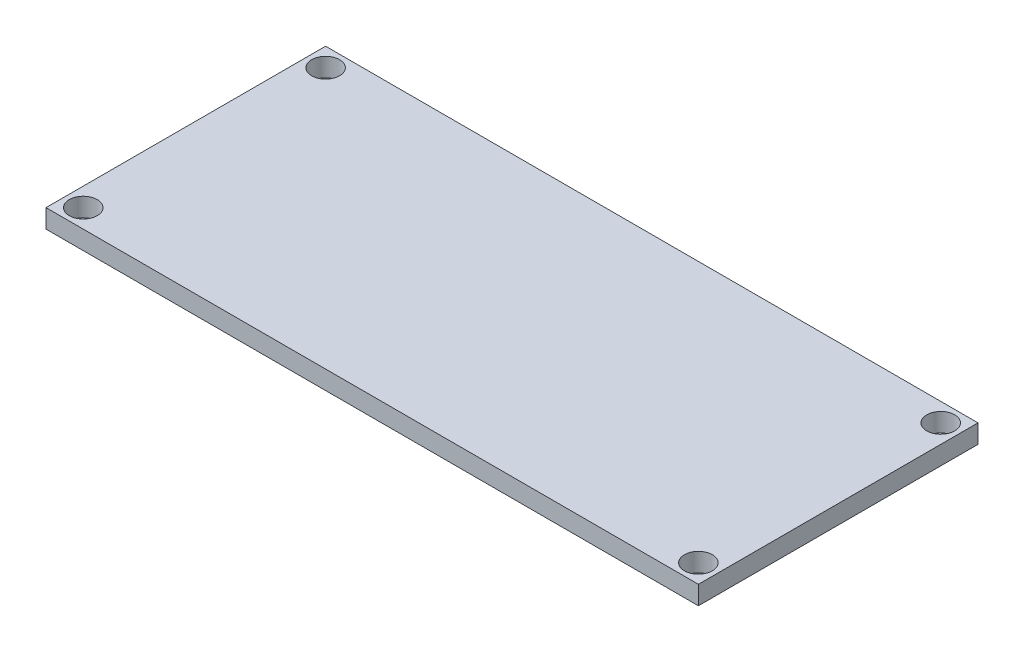
ISO-10303-21;
HEADER;
FILE_DESCRIPTION(('STEP AP214'),'2;1');
FILE_NAME('part.step','',(''),(''),'','','');
FILE_SCHEMA(('AUTOMOTIVE_DESIGN { 1 0 10303 214 1 1 1 1 }'));
ENDSEC;
DATA;
#1=APPLICATION_CONTEXT('core data for automotive mechanical design processes');
#2=APPLICATION_PROTOCOL_DEFINITION('international standard','automotive_design',2000,#1);
#3=PRODUCT_CONTEXT('',#1,'mechanical');
#4=PRODUCT('Part','Part','',(#3));
#5=PRODUCT_RELATED_PRODUCT_CATEGORY('part','',(#4));
#6=PRODUCT_DEFINITION_FORMATION('','',#4);
#7=PRODUCT_DEFINITION_CONTEXT('part definition',#1,'design');
#8=PRODUCT_DEFINITION('design','',#6,#7);
#9=PRODUCT_DEFINITION_SHAPE('','',#8);
#10=(LENGTH_UNIT() NAMED_UNIT(*) SI_UNIT(.MILLI.,.METRE.));
#11=(NAMED_UNIT(*) PLANE_ANGLE_UNIT() SI_UNIT($,.RADIAN.));
#12=(NAMED_UNIT(*) SI_UNIT($,.STERADIAN.) SOLID_ANGLE_UNIT());
#13=UNCERTAINTY_MEASURE_WITH_UNIT(LENGTH_MEASURE(1.E-05),#10,'distance_accuracy_value','');
#14=(GEOMETRIC_REPRESENTATION_CONTEXT(3) GLOBAL_UNCERTAINTY_ASSIGNED_CONTEXT((#13)) GLOBAL_UNIT_ASSIGNED_CONTEXT((#10,
#11,#12)) REPRESENTATION_CONTEXT('',''));
#15=CARTESIAN_POINT('',(0.,0.,0.));
#16=DIRECTION('',(0.,0.,1.));
#17=DIRECTION('',(1.,0.,0.));
#18=AXIS2_PLACEMENT_3D('',#15,#16,#17);
#19=CARTESIAN_POINT('',(70.,2.,0.));
#20=DIRECTION('',(1.,0.,0.));
#21=DIRECTION('',(0.,0.,-1.));
#22=AXIS2_PLACEMENT_3D('',#19,#20,#21);
#23=PLANE('',#22);
#24=DIRECTION('',(0.,0.,1.));
#25=VECTOR('',#24,1.);
#26=CARTESIAN_POINT('',(70.,0.,0.));
#27=LINE('',#26,#25);
#28=CARTESIAN_POINT('',(70.,0.,0.));
#29=VERTEX_POINT('',#28);
#30=CARTESIAN_POINT('',(70.,0.,30.));
#31=VERTEX_POINT('',#30);
#32=EDGE_CURVE('E115',#29,#31,#27,.T.);
#33=ORIENTED_EDGE('',*,*,#32,.F.);
#34=DIRECTION('',(0.,-1.,0.));
#35=VECTOR('',#34,1.);
#36=CARTESIAN_POINT('',(70.,2.,0.));
#37=LINE('',#36,#35);
#38=CARTESIAN_POINT('',(70.,2.,0.));
#39=VERTEX_POINT('',#38);
#40=EDGE_CURVE('E11',#39,#29,#37,.T.);
#41=ORIENTED_EDGE('',*,*,#40,.F.);
#42=DIRECTION('',(0.,0.,1.));
#43=VECTOR('',#42,1.);
#44=CARTESIAN_POINT('',(70.,2.,0.));
#45=LINE('',#44,#43);
#46=CARTESIAN_POINT('',(70.,2.,30.));
#47=VERTEX_POINT('',#46);
#48=EDGE_CURVE('E96',#39,#47,#45,.T.);
#49=ORIENTED_EDGE('',*,*,#48,.T.);
#50=DIRECTION('',(0.,-1.,0.));
#51=VECTOR('',#50,1.);
#52=CARTESIAN_POINT('',(70.,2.,30.));
#53=LINE('',#52,#51);
#54=EDGE_CURVE('E75',#47,#31,#53,.T.);
#55=ORIENTED_EDGE('',*,*,#54,.T.);
#56=EDGE_LOOP('',(#33,#41,#49,#55));
#57=FACE_BOUND('',#56,.T.);
#58=ADVANCED_FACE('F35',(#57),#23,.T.);
#59=CARTESIAN_POINT('',(0.,2.,0.));
#60=DIRECTION('',(0.,0.,-1.));
#61=DIRECTION('',(-1.,0.,0.));
#62=AXIS2_PLACEMENT_3D('',#59,#60,#61);
#63=PLANE('',#62);
#64=DIRECTION('',(1.,0.,0.));
#65=VECTOR('',#64,1.);
#66=CARTESIAN_POINT('',(0.,0.,0.));
#67=LINE('',#66,#65);
#68=CARTESIAN_POINT('',(0.,0.,0.));
#69=VERTEX_POINT('',#68);
#70=EDGE_CURVE('E87',#69,#29,#67,.T.);
#71=ORIENTED_EDGE('',*,*,#70,.F.);
#72=DIRECTION('',(0.,-1.,0.));
#73=VECTOR('',#72,1.);
#74=CARTESIAN_POINT('',(0.,2.,0.));
#75=LINE('',#74,#73);
#76=CARTESIAN_POINT('',(0.,2.,0.));
#77=VERTEX_POINT('',#76);
#78=EDGE_CURVE('E44',#77,#69,#75,.T.);
#79=ORIENTED_EDGE('',*,*,#78,.F.);
#80=DIRECTION('',(1.,0.,0.));
#81=VECTOR('',#80,1.);
#82=CARTESIAN_POINT('',(0.,2.,0.));
#83=LINE('',#82,#81);
#84=EDGE_CURVE('E85',#77,#39,#83,.T.);
#85=ORIENTED_EDGE('',*,*,#84,.T.);
#86=ORIENTED_EDGE('',*,*,#40,.T.);
#87=EDGE_LOOP('',(#71,#79,#85,#86));
#88=FACE_BOUND('',#87,.T.);
#89=ADVANCED_FACE('F83',(#88),#63,.T.);
#90=CARTESIAN_POINT('',(0.,2.,0.));
#91=DIRECTION('',(1.,0.,0.));
#92=DIRECTION('',(0.,0.,-1.));
#93=AXIS2_PLACEMENT_3D('',#90,#91,#92);
#94=PLANE('',#93);
#95=DIRECTION('',(0.,0.,1.));
#96=VECTOR('',#95,1.);
#97=CARTESIAN_POINT('',(0.,0.,0.));
#98=LINE('',#97,#96);
#99=CARTESIAN_POINT('',(0.,0.,30.));
#100=VERTEX_POINT('',#99);
#101=EDGE_CURVE('E118',#69,#100,#98,.T.);
#102=ORIENTED_EDGE('',*,*,#101,.T.);
#103=DIRECTION('',(0.,-1.,0.));
#104=VECTOR('',#103,1.);
#105=CARTESIAN_POINT('',(0.,2.,30.));
#106=LINE('',#105,#104);
#107=CARTESIAN_POINT('',(0.,2.,30.));
#108=VERTEX_POINT('',#107);
#109=EDGE_CURVE('E90',#108,#100,#106,.T.);
#110=ORIENTED_EDGE('',*,*,#109,.F.);
#111=DIRECTION('',(0.,0.,1.));
#112=VECTOR('',#111,1.);
#113=CARTESIAN_POINT('',(0.,2.,0.));
#114=LINE('',#113,#112);
#115=EDGE_CURVE('E92',#77,#108,#114,.T.);
#116=ORIENTED_EDGE('',*,*,#115,.F.);
#117=ORIENTED_EDGE('',*,*,#78,.T.);
#118=EDGE_LOOP('',(#102,#110,#116,#117));
#119=FACE_BOUND('',#118,.T.);
#120=ADVANCED_FACE('F93',(#119),#94,.F.);
#121=CARTESIAN_POINT('',(2.,2.,2.));
#122=DIRECTION('',(0.,-1.,0.));
#123=DIRECTION('',(0.,0.,-1.));
#124=AXIS2_PLACEMENT_3D('',#121,#122,#123);
#125=CYLINDRICAL_SURFACE('',#124,1.5);
#126=CARTESIAN_POINT('',(2.,2.,2.));
#127=DIRECTION('',(0.,1.,0.));
#128=DIRECTION('',(0.,0.,1.));
#129=AXIS2_PLACEMENT_3D('',#126,#127,#128);
#130=CIRCLE('',#129,1.5);
#131=CARTESIAN_POINT('',(2.,2.,3.5));
#132=VERTEX_POINT('',#131);
#133=EDGE_CURVE('E98',#132,#132,#130,.T.);
#134=ORIENTED_EDGE('',*,*,#133,.T.);
#135=EDGE_LOOP('',(#134));
#136=FACE_BOUND('',#135,.T.);
#137=CARTESIAN_POINT('',(2.,0.,2.));
#138=DIRECTION('',(0.,1.,0.));
#139=DIRECTION('',(0.,0.,1.));
#140=AXIS2_PLACEMENT_3D('',#137,#138,#139);
#141=CIRCLE('',#140,1.5);
#142=CARTESIAN_POINT('',(2.,0.,3.5));
#143=VERTEX_POINT('',#142);
#144=EDGE_CURVE('E112',#143,#143,#141,.T.);
#145=ORIENTED_EDGE('',*,*,#144,.F.);
#146=EDGE_LOOP('',(#145));
#147=FACE_BOUND('',#146,.T.);
#148=ADVANCED_FACE('F134',(#136,#147),#125,.F.);
#149=CARTESIAN_POINT('',(68.,2.,1.99999999999908));
#150=DIRECTION('',(0.,-1.,0.));
#151=DIRECTION('',(0.,0.,-1.));
#152=AXIS2_PLACEMENT_3D('',#149,#150,#151);
#153=CYLINDRICAL_SURFACE('',#152,1.5);
#154=CARTESIAN_POINT('',(68.,2.,1.99999999999908));
#155=DIRECTION('',(0.,1.,0.));
#156=DIRECTION('',(0.,0.,1.));
#157=AXIS2_PLACEMENT_3D('',#154,#155,#156);
#158=CIRCLE('',#157,1.5);
#159=CARTESIAN_POINT('',(68.,2.,3.49999999999908));
#160=VERTEX_POINT('',#159);
#161=EDGE_CURVE('E234',#160,#160,#158,.T.);
#162=ORIENTED_EDGE('',*,*,#161,.T.);
#163=EDGE_LOOP('',(#162));
#164=FACE_BOUND('',#163,.T.);
#165=CARTESIAN_POINT('',(68.,0.,1.99999999999908));
#166=DIRECTION('',(0.,1.,0.));
#167=DIRECTION('',(0.,0.,1.));
#168=AXIS2_PLACEMENT_3D('',#165,#166,#167);
#169=CIRCLE('',#168,1.5);
#170=CARTESIAN_POINT('',(68.,0.,3.49999999999908));
#171=VERTEX_POINT('',#170);
#172=EDGE_CURVE('E109',#171,#171,#169,.T.);
#173=ORIENTED_EDGE('',*,*,#172,.F.);
#174=EDGE_LOOP('',(#173));
#175=FACE_BOUND('',#174,.T.);
#176=ADVANCED_FACE('F137',(#164,#175),#153,.F.);
#177=CARTESIAN_POINT('',(2.00000000000027,2.,28.));
#178=DIRECTION('',(0.,-1.,0.));
#179=DIRECTION('',(0.,0.,-1.));
#180=AXIS2_PLACEMENT_3D('',#177,#178,#179);
#181=CYLINDRICAL_SURFACE('',#180,1.5);
#182=CARTESIAN_POINT('',(2.00000000000027,2.,28.));
#183=DIRECTION('',(0.,1.,0.));
#184=DIRECTION('',(0.,0.,1.));
#185=AXIS2_PLACEMENT_3D('',#182,#183,#184);
#186=CIRCLE('',#185,1.5);
#187=CARTESIAN_POINT('',(2.00000000000027,2.,29.5));
#188=VERTEX_POINT('',#187);
#189=EDGE_CURVE('E151',#188,#188,#186,.T.);
#190=ORIENTED_EDGE('',*,*,#189,.T.);
#191=EDGE_LOOP('',(#190));
#192=FACE_BOUND('',#191,.T.);
#193=CARTESIAN_POINT('',(2.00000000000027,0.,28.));
#194=DIRECTION('',(0.,1.,0.));
#195=DIRECTION('',(0.,0.,1.));
#196=AXIS2_PLACEMENT_3D('',#193,#194,#195);
#197=CIRCLE('',#196,1.5);
#198=CARTESIAN_POINT('',(2.00000000000027,0.,29.5));
#199=VERTEX_POINT('',#198);
#200=EDGE_CURVE('E106',#199,#199,#197,.T.);
#201=ORIENTED_EDGE('',*,*,#200,.F.);
#202=EDGE_LOOP('',(#201));
#203=FACE_BOUND('',#202,.T.);
#204=ADVANCED_FACE('F140',(#192,#203),#181,.F.);
#205=CARTESIAN_POINT('',(68.0000000000003,2.,27.9999999999991));
#206=DIRECTION('',(0.,-1.,0.));
#207=DIRECTION('',(0.,0.,-1.));
#208=AXIS2_PLACEMENT_3D('',#205,#206,#207);
#209=CYLINDRICAL_SURFACE('',#208,1.5);
#210=CARTESIAN_POINT('',(68.0000000000003,2.,27.9999999999991));
#211=DIRECTION('',(0.,1.,0.));
#212=DIRECTION('',(0.,0.,1.));
#213=AXIS2_PLACEMENT_3D('',#210,#211,#212);
#214=CIRCLE('',#213,1.5);
#215=CARTESIAN_POINT('',(68.0000000000003,2.,29.4999999999991));
#216=VERTEX_POINT('',#215);
#217=EDGE_CURVE('E121',#216,#216,#214,.T.);
#218=ORIENTED_EDGE('',*,*,#217,.T.);
#219=EDGE_LOOP('',(#218));
#220=FACE_BOUND('',#219,.T.);
#221=CARTESIAN_POINT('',(68.0000000000003,0.,27.9999999999991));
#222=DIRECTION('',(0.,1.,0.));
#223=DIRECTION('',(0.,0.,1.));
#224=AXIS2_PLACEMENT_3D('',#221,#222,#223);
#225=CIRCLE('',#224,1.5);
#226=CARTESIAN_POINT('',(68.0000000000003,0.,29.4999999999991));
#227=VERTEX_POINT('',#226);
#228=EDGE_CURVE('E103',#227,#227,#225,.T.);
#229=ORIENTED_EDGE('',*,*,#228,.F.);
#230=EDGE_LOOP('',(#229));
#231=FACE_BOUND('',#230,.T.);
#232=ADVANCED_FACE('F37',(#220,#231),#209,.F.);
#233=CARTESIAN_POINT('',(0.,2.,30.));
#234=DIRECTION('',(0.,0.,-1.));
#235=DIRECTION('',(-1.,0.,0.));
#236=AXIS2_PLACEMENT_3D('',#233,#234,#235);
#237=PLANE('',#236);
#238=DIRECTION('',(1.,0.,0.));
#239=VECTOR('',#238,1.);
#240=CARTESIAN_POINT('',(0.,0.,30.));
#241=LINE('',#240,#239);
#242=EDGE_CURVE('E68',#100,#31,#241,.T.);
#243=ORIENTED_EDGE('',*,*,#242,.T.);
#244=ORIENTED_EDGE('',*,*,#54,.F.);
#245=DIRECTION('',(1.,0.,0.));
#246=VECTOR('',#245,1.);
#247=CARTESIAN_POINT('',(0.,2.,30.));
#248=LINE('',#247,#246);
#249=EDGE_CURVE('E52',#108,#47,#248,.T.);
#250=ORIENTED_EDGE('',*,*,#249,.F.);
#251=ORIENTED_EDGE('',*,*,#109,.T.);
#252=EDGE_LOOP('',(#243,#244,#250,#251));
#253=FACE_BOUND('',#252,.T.);
#254=ADVANCED_FACE('F124',(#253),#237,.F.);
#255=CARTESIAN_POINT('',(0.,2.,0.));
#256=DIRECTION('',(0.,1.,0.));
#257=DIRECTION('',(0.,0.,1.));
#258=AXIS2_PLACEMENT_3D('',#255,#256,#257);
#259=PLANE('',#258);
#260=ORIENTED_EDGE('',*,*,#217,.F.);
#261=EDGE_LOOP('',(#260));
#262=FACE_BOUND('',#261,.T.);
#263=ORIENTED_EDGE('',*,*,#189,.F.);
#264=EDGE_LOOP('',(#263));
#265=FACE_BOUND('',#264,.T.);
#266=ORIENTED_EDGE('',*,*,#161,.F.);
#267=EDGE_LOOP('',(#266));
#268=FACE_BOUND('',#267,.T.);
#269=ORIENTED_EDGE('',*,*,#133,.F.);
#270=EDGE_LOOP('',(#269));
#271=FACE_BOUND('',#270,.T.);
#272=ORIENTED_EDGE('',*,*,#48,.F.);
#273=ORIENTED_EDGE('',*,*,#84,.F.);
#274=ORIENTED_EDGE('',*,*,#115,.T.);
#275=ORIENTED_EDGE('',*,*,#249,.T.);
#276=EDGE_LOOP('',(#272,#273,#274,#275));
#277=FACE_BOUND('',#276,.T.);
#278=ADVANCED_FACE('F95',(#262,#265,#268,#271,#277),#259,.T.);
#279=CARTESIAN_POINT('',(0.,0.,0.));
#280=DIRECTION('',(0.,1.,0.));
#281=DIRECTION('',(0.,0.,1.));
#282=AXIS2_PLACEMENT_3D('',#279,#280,#281);
#283=PLANE('',#282);
#284=ORIENTED_EDGE('',*,*,#228,.T.);
#285=EDGE_LOOP('',(#284));
#286=FACE_BOUND('',#285,.T.);
#287=ORIENTED_EDGE('',*,*,#200,.T.);
#288=EDGE_LOOP('',(#287));
#289=FACE_BOUND('',#288,.T.);
#290=ORIENTED_EDGE('',*,*,#172,.T.);
#291=EDGE_LOOP('',(#290));
#292=FACE_BOUND('',#291,.T.);
#293=ORIENTED_EDGE('',*,*,#144,.T.);
#294=EDGE_LOOP('',(#293));
#295=FACE_BOUND('',#294,.T.);
#296=ORIENTED_EDGE('',*,*,#32,.T.);
#297=ORIENTED_EDGE('',*,*,#242,.F.);
#298=ORIENTED_EDGE('',*,*,#101,.F.);
#299=ORIENTED_EDGE('',*,*,#70,.T.);
#300=EDGE_LOOP('',(#296,#297,#298,#299));
#301=FACE_BOUND('',#300,.T.);
#302=ADVANCED_FACE('F125',(#286,#289,#292,#295,#301),#283,.F.);
#303=CLOSED_SHELL('',(#58,#89,#120,#148,#176,#204,#232,#254,#278,#302));
#304=MANIFOLD_SOLID_BREP('B2',#303);
#305=ADVANCED_BREP_SHAPE_REPRESENTATION('',(#18,#304),#14);
#306=SHAPE_DEFINITION_REPRESENTATION(#9,#305);
ENDSEC;
END-ISO-10303-21;
